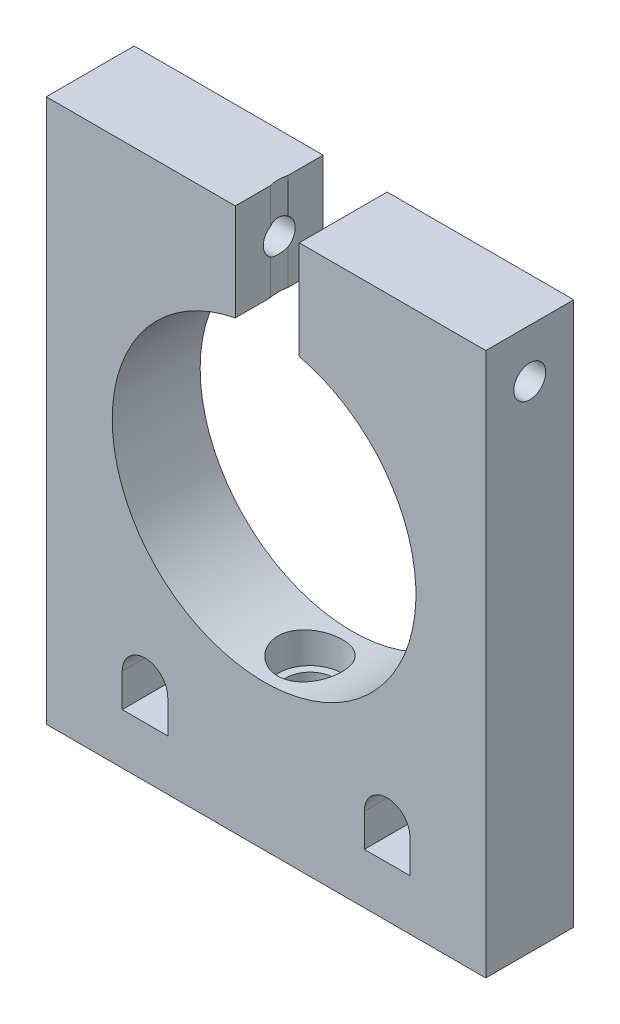
ISO-10303-21;
HEADER;
FILE_DESCRIPTION(('STEP AP214'),'2;1');
FILE_NAME('part.step','',(''),(''),'','','');
FILE_SCHEMA(('AUTOMOTIVE_DESIGN { 1 0 10303 214 1 1 1 1 }'));
ENDSEC;
DATA;
#1=APPLICATION_CONTEXT('core data for automotive mechanical design processes');
#2=APPLICATION_PROTOCOL_DEFINITION('international standard','automotive_design',2000,#1);
#3=PRODUCT_CONTEXT('',#1,'mechanical');
#4=PRODUCT('Part','Part','',(#3));
#5=PRODUCT_RELATED_PRODUCT_CATEGORY('part','',(#4));
#6=PRODUCT_DEFINITION_FORMATION('','',#4);
#7=PRODUCT_DEFINITION_CONTEXT('part definition',#1,'design');
#8=PRODUCT_DEFINITION('design','',#6,#7);
#9=PRODUCT_DEFINITION_SHAPE('','',#8);
#10=(LENGTH_UNIT() NAMED_UNIT(*) SI_UNIT(.MILLI.,.METRE.));
#11=(NAMED_UNIT(*) PLANE_ANGLE_UNIT() SI_UNIT($,.RADIAN.));
#12=(NAMED_UNIT(*) SI_UNIT($,.STERADIAN.) SOLID_ANGLE_UNIT());
#13=UNCERTAINTY_MEASURE_WITH_UNIT(LENGTH_MEASURE(1.E-05),#10,'distance_accuracy_value','');
#14=(GEOMETRIC_REPRESENTATION_CONTEXT(3) GLOBAL_UNCERTAINTY_ASSIGNED_CONTEXT((#13)) GLOBAL_UNIT_ASSIGNED_CONTEXT((#10,
#11,#12)) REPRESENTATION_CONTEXT('',''));
#15=CARTESIAN_POINT('',(0.,0.,0.));
#16=DIRECTION('',(0.,0.,1.));
#17=DIRECTION('',(1.,0.,0.));
#18=AXIS2_PLACEMENT_3D('',#15,#16,#17);
#19=CARTESIAN_POINT('',(-27.7462012428168,61.1736842105263,-6.00000000000001));
#20=DIRECTION('',(0.,0.,1.));
#21=DIRECTION('',(1.,0.,0.));
#22=AXIS2_PLACEMENT_3D('',#19,#20,#21);
#23=CYLINDRICAL_SURFACE('',#22,19.);
#24=CARTESIAN_POINT('',(-27.5,42.1752794104376,1.5));
#25=CARTESIAN_POINT('',(-27.7217018666897,42.1724103715578,1.50000770008445));
#26=CARTESIAN_POINT('',(-27.9435489338754,42.1734522579613,1.51849377762637));
#27=CARTESIAN_POINT('',(-28.3810596743175,42.1830299780645,1.59193005395871));
#28=CARTESIAN_POINT('',(-28.5967187785293,42.1915712091654,1.64690650851482));
#29=CARTESIAN_POINT('',(-29.0154614967003,42.214967725388,1.79157814962321));
#30=CARTESIAN_POINT('',(-29.2185565823367,42.2298171502916,1.8812411060413));
#31=CARTESIAN_POINT('',(-29.6068470708586,42.2640031779429,2.09264425718337));
#32=CARTESIAN_POINT('',(-29.7920431711632,42.2833396057585,2.21438320140393));
#33=CARTESIAN_POINT('',(-30.141833879553,42.324483118063,2.48824714392955));
#34=CARTESIAN_POINT('',(-30.3061469341108,42.3463176770726,2.64072762181321));
#35=CARTESIAN_POINT('',(-30.6070841731015,42.3896878719763,2.97097971039865));
#36=CARTESIAN_POINT('',(-30.7437060135643,42.4112234824217,3.14875345992677));
#37=CARTESIAN_POINT('',(-30.9868347341818,42.4516730332829,3.52691687410489));
#38=CARTESIAN_POINT('',(-31.09299431525,42.4705555759409,3.72753352261765));
#39=CARTESIAN_POINT('',(-31.2700085668532,42.5030941345313,4.14417803793059));
#40=CARTESIAN_POINT('',(-31.3408664806165,42.5167506305635,4.36020448691905));
#41=CARTESIAN_POINT('',(-31.4444275066021,42.5370026095041,4.7988161853216));
#42=CARTESIAN_POINT('',(-31.4775756904269,42.5436803810367,5.02129245204782));
#43=CARTESIAN_POINT('',(-31.5061536533168,42.5494262448601,5.46874110995883));
#44=CARTESIAN_POINT('',(-31.5015872772187,42.5484951128458,5.69371324436551));
#45=CARTESIAN_POINT('',(-31.4552516179099,42.539214291872,6.13618187179868));
#46=CARTESIAN_POINT('',(-31.4140443723721,42.5309766823904,6.35373993701321));
#47=CARTESIAN_POINT('',(-31.2964871676965,42.5082342789288,6.77879455751179));
#48=CARTESIAN_POINT('',(-31.2201354734391,42.4937291755179,6.98629061546449));
#49=CARTESIAN_POINT('',(-31.0339294373112,42.4600579644794,7.38691919996178));
#50=CARTESIAN_POINT('',(-30.9238567040569,42.440861643569,7.57994757290868));
#51=CARTESIAN_POINT('',(-30.6734728013341,42.4001091085841,7.94501026113929));
#52=CARTESIAN_POINT('',(-30.5331581714218,42.3785526245859,8.11704217036097));
#53=CARTESIAN_POINT('',(-30.2233363838518,42.3351959851917,8.4383862762789));
#54=CARTESIAN_POINT('',(-30.0533608008815,42.3133981783266,8.58724756877836));
#55=CARTESIAN_POINT('',(-29.6905820930684,42.2725560190596,8.85441415929888));
#56=CARTESIAN_POINT('',(-29.4977789330365,42.2535116709024,8.9727194102164));
#57=CARTESIAN_POINT('',(-29.0946319497242,42.2205158896697,9.17532815879864));
#58=CARTESIAN_POINT('',(-28.8842874955252,42.2065646398779,9.2596304328205));
#59=CARTESIAN_POINT('',(-28.4520819448592,42.1855698088592,9.39160331358108));
#60=CARTESIAN_POINT('',(-28.2302223748571,42.1785253145101,9.439278762466));
#61=CARTESIAN_POINT('',(-27.7855699893244,42.1724474977032,9.49597058400664));
#62=CARTESIAN_POINT('',(-27.5628655433673,42.1732725275786,9.50566608257451));
#63=CARTESIAN_POINT('',(-27.1191091576289,42.1827388920937,9.48801016240768));
#64=CARTESIAN_POINT('',(-26.8980571369785,42.1913798416672,9.46066056873698));
#65=CARTESIAN_POINT('',(-26.4656252527902,42.2156597319631,9.37020576322975));
#66=CARTESIAN_POINT('',(-26.2541833929784,42.2312435600566,9.30738112226466));
#67=CARTESIAN_POINT('',(-25.8448770216619,42.2679382518016,9.14812352359072));
#68=CARTESIAN_POINT('',(-25.6470137694562,42.2890496272135,9.05168745373929));
#69=CARTESIAN_POINT('',(-25.2671304321559,42.3351222052682,8.826233294048));
#70=CARTESIAN_POINT('',(-25.0854011965301,42.3601376796443,8.69673639361866));
#71=CARTESIAN_POINT('',(-24.7460187765882,42.4112639937943,8.40947196415671));
#72=CARTESIAN_POINT('',(-24.5883685947711,42.4373749696534,8.25170091484635));
#73=CARTESIAN_POINT('',(-24.2988656475771,42.4884520564316,7.90912352046247));
#74=CARTESIAN_POINT('',(-24.1674987525957,42.5133910441364,7.72390195248407));
#75=CARTESIAN_POINT('',(-23.937767776736,42.5589157083065,7.33351722348626));
#76=CARTESIAN_POINT('',(-23.839401852302,42.5795016279266,7.12835517724149));
#77=CARTESIAN_POINT('',(-23.6793216444684,42.6138570085229,6.70545939718692));
#78=CARTESIAN_POINT('',(-23.6173309005816,42.6276777495585,6.4878346629939));
#79=CARTESIAN_POINT('',(-23.5308735425515,42.6471353371888,6.04491011001001));
#80=CARTESIAN_POINT('',(-23.5064007392161,42.6527735336185,5.81961156340865));
#81=CARTESIAN_POINT('',(-23.4959215704313,42.6551761673556,5.37320256340272));
#82=CARTESIAN_POINT('',(-23.509056087679,42.6521387968138,5.15211289859532));
#83=CARTESIAN_POINT('',(-23.5715099361637,42.6379630294477,4.71538301869289));
#84=CARTESIAN_POINT('',(-23.6208288181704,42.6268247331968,4.49974273597795));
#85=CARTESIAN_POINT('',(-23.7538532039274,42.5977391761712,4.08064444546885));
#86=CARTESIAN_POINT('',(-23.8374448255584,42.5798144803386,3.8771486250396));
#87=CARTESIAN_POINT('',(-24.036530551839,42.5390760180119,3.48695078764513));
#88=CARTESIAN_POINT('',(-24.1520279782906,42.5162617425057,3.30025052199631));
#89=CARTESIAN_POINT('',(-24.4144784872118,42.4675954691897,2.94473299038067));
#90=CARTESIAN_POINT('',(-24.5620387174293,42.4416899347938,2.77637120044933));
#91=CARTESIAN_POINT('',(-24.883168787113,42.3899293555899,2.46652185808063));
#92=CARTESIAN_POINT('',(-25.0567450098294,42.3640743247549,2.32504092046722));
#93=CARTESIAN_POINT('',(-25.4279746293888,42.3146981756074,2.0710016463401));
#94=CARTESIAN_POINT('',(-25.6259395192041,42.2912161519886,1.95889047293757));
#95=CARTESIAN_POINT('',(-26.0383505886409,42.2494656129186,1.76972453952534));
#96=CARTESIAN_POINT('',(-26.252782522922,42.2311926542788,1.69263986933367));
#97=CARTESIAN_POINT('',(-26.6395670090449,42.2051956948389,1.58980171357834));
#98=CARTESIAN_POINT('',(-26.809775863227,42.1959957168126,1.55619479211134));
#99=CARTESIAN_POINT('',(-27.1532936285642,42.1821596416176,1.51129141203475));
#100=CARTESIAN_POINT('',(-27.3266024037937,42.1775233448374,1.49999397760536));
#101=CARTESIAN_POINT('',(-27.5,42.1752794104376,1.5));
#102=B_SPLINE_CURVE_WITH_KNOTS('',3,(#24,#25,#26,#27,#28,#29,#30,#31,#32,#33,#34,#35,#36,#37,
#38,#39,#40,#41,#42,#43,#44,#45,#46,#47,#48,#49,#50,#51,#52,#53,#54,#55,#56,#57,#58,#59,#60,#61,
#62,#63,#64,#65,#66,#67,#68,#69,#70,#71,#72,#73,#74,#75,#76,#77,#78,#79,#80,#81,#82,#83,#84,#85,
#86,#87,#88,#89,#90,#91,#92,#93,#94,#95,#96,#97,#98,#99,#100,#101),.UNSPECIFIED.,.T.,.F.,(4,2,2,
2,2,2,2,2,2,2,2,2,2,2,2,2,2,2,2,2,2,2,2,2,2,2,2,2,2,2,2,2,2,2,2,2,2,2,4),(0.,0.664528654488198,
1.3295359735315,1.99392685701593,2.65829184261749,3.33083213152481,4.00342932500227,
4.68341499985382,5.36333819166216,6.03515046541458,6.70689425164483,7.36850851197358,
8.03015544042002,8.69618145180882,9.3622837140513,10.0400572364839,10.7178318037294,
11.3956307594287,12.0733400932004,12.7388743340253,13.4043757878242,14.0646860893265,
14.7250575463952,15.3955969010377,16.066219799372,16.7482810160543,17.4303041239376,
18.1070741987338,18.7837326173244,19.4450573401633,20.1063738527692,20.7655105131123,
21.4247158238861,22.0977028573266,22.7708552851252,23.4537284428992,24.1360173738501,
24.6557816565066,25.1755232041037),.UNSPECIFIED.);
#103=CARTESIAN_POINT('',(-27.5,42.1752794104376,1.5));
#104=VERTEX_POINT('',#103);
#105=EDGE_CURVE('E257',#104,#104,#102,.T.);
#106=ORIENTED_EDGE('',*,*,#105,.F.);
#107=EDGE_LOOP('',(#106));
#108=FACE_BOUND('',#107,.T.);
#109=CARTESIAN_POINT('',(-31.3503534506357,79.828712671048,6.58387190441372));
#110=CARTESIAN_POINT('',(-31.3806292223616,79.8228563577791,6.47636807262866));
#111=CARTESIAN_POINT('',(-31.4063895866646,79.8178097405828,6.36754745538005));
#112=CARTESIAN_POINT('',(-31.4487349312383,79.809450369709,6.14804444104768));
#113=CARTESIAN_POINT('',(-31.4653178308129,79.8061380092278,6.03736162762665));
#114=CARTESIAN_POINT('',(-31.4888758890616,79.8014192512206,5.8175118380989));
#115=CARTESIAN_POINT('',(-31.4960631505597,79.7999707891789,5.70836850737569));
#116=CARTESIAN_POINT('',(-31.5014797146783,79.7988790506932,5.48989423768962));
#117=CARTESIAN_POINT('',(-31.4997119835581,79.7992351764959,5.38056337283989));
#118=CARTESIAN_POINT('',(-31.485249891384,79.8021476422983,5.1279491714312));
#119=CARTESIAN_POINT('',(-31.4692804037088,79.8053634531291,4.98485000692258));
#120=CARTESIAN_POINT('',(-31.4217267091787,79.8147918662821,4.69908975122264));
#121=CARTESIAN_POINT('',(-31.3899047216102,79.8210500675667,4.55646969743279));
#122=CARTESIAN_POINT('',(-31.3503534506357,79.828712671048,4.41612809558628));
#123=B_SPLINE_CURVE_WITH_KNOTS('',3,(#109,#110,#111,#112,#113,#114,#115,#116,#117,#118,#119,
#120,#121,#122),.UNSPECIFIED.,.F.,.F.,(4,2,2,2,2,2,4),(0.,0.335418724365017,0.67091346305818,
0.998695724341374,1.32636941785424,1.7575489207512,2.1953999921887),.UNSPECIFIED.);
#124=CARTESIAN_POINT('',(-31.3503534506357,79.828712671048,6.58387190441372));
#125=VERTEX_POINT('',#124);
#126=CARTESIAN_POINT('',(-31.3503534506357,79.828712671048,4.41612809558628));
#127=VERTEX_POINT('',#126);
#128=EDGE_CURVE('E250',#125,#127,#123,.T.);
#129=ORIENTED_EDGE('',*,*,#128,.F.);
#130=DIRECTION('',(0.,0.,1.));
#131=VECTOR('',#130,1.);
#132=CARTESIAN_POINT('',(-31.3503534506357,79.828712671048,-6.00000000000001));
#133=LINE('',#132,#131);
#134=CARTESIAN_POINT('',(-31.3503534506357,79.828712671048,11.));
#135=VERTEX_POINT('',#134);
#136=EDGE_CURVE('E308',#125,#135,#133,.T.);
#137=ORIENTED_EDGE('',*,*,#136,.T.);
#138=CARTESIAN_POINT('',(-27.7462012428168,61.1736842105263,11.));
#139=DIRECTION('',(0.,0.,-1.));
#140=DIRECTION('',(-1.,0.,0.));
#141=AXIS2_PLACEMENT_3D('',#138,#139,#140);
#142=CIRCLE('',#141,19.);
#143=CARTESIAN_POINT('',(-23.3503534506357,79.6581783120152,11.));
#144=VERTEX_POINT('',#143);
#145=EDGE_CURVE('E394',#135,#144,#142,.F.);
#146=ORIENTED_EDGE('',*,*,#145,.T.);
#147=DIRECTION('',(0.,0.,1.));
#148=VECTOR('',#147,1.);
#149=CARTESIAN_POINT('',(-23.3503534506357,79.6581783120152,-6.00000000000001));
#150=LINE('',#149,#148);
#151=CARTESIAN_POINT('',(-23.3503534506357,79.6581783120152,0.));
#152=VERTEX_POINT('',#151);
#153=EDGE_CURVE('E304',#152,#144,#150,.T.);
#154=ORIENTED_EDGE('',*,*,#153,.F.);
#155=CARTESIAN_POINT('',(-27.7462012428168,61.1736842105263,0.));
#156=DIRECTION('',(0.,0.,1.));
#157=DIRECTION('',(1.,0.,0.));
#158=AXIS2_PLACEMENT_3D('',#155,#156,#157);
#159=CIRCLE('',#158,19.);
#160=CARTESIAN_POINT('',(-31.3503534506357,79.828712671048,0.));
#161=VERTEX_POINT('',#160);
#162=EDGE_CURVE('E313',#161,#152,#159,.T.);
#163=ORIENTED_EDGE('',*,*,#162,.F.);
#164=EDGE_CURVE('E200',#161,#127,#133,.T.);
#165=ORIENTED_EDGE('',*,*,#164,.T.);
#166=EDGE_LOOP('',(#129,#137,#146,#154,#163,#165));
#167=FACE_BOUND('',#166,.T.);
#168=ADVANCED_FACE('F33',(#108,#167),#23,.F.);
#169=CARTESIAN_POINT('',(-31.3503534506357,93.8364690107768,-35.));
#170=DIRECTION('',(-1.,0.,0.));
#171=DIRECTION('',(0.,0.,1.));
#172=AXIS2_PLACEMENT_3D('',#169,#170,#171);
#173=PLANE('',#172);
#174=DIRECTION('',(0.,-1.,0.));
#175=VECTOR('',#174,1.);
#176=CARTESIAN_POINT('',(-31.3503534506357,127.5,4.41612809558628));
#177=LINE('',#176,#175);
#178=CARTESIAN_POINT('',(-31.3503534506357,84.2078129318689,4.41612809558628));
#179=VERTEX_POINT('',#178);
#180=EDGE_CURVE('E53',#127,#179,#177,.F.);
#181=ORIENTED_EDGE('',*,*,#180,.F.);
#182=ORIENTED_EDGE('',*,*,#164,.F.);
#183=DIRECTION('',(0.,-1.,0.));
#184=VECTOR('',#183,1.);
#185=CARTESIAN_POINT('',(-31.3503534506357,0.,0.));
#186=LINE('',#185,#184);
#187=CARTESIAN_POINT('',(-31.3503534506357,91.9736842105263,0.));
#188=VERTEX_POINT('',#187);
#189=EDGE_CURVE('E327',#188,#161,#186,.T.);
#190=ORIENTED_EDGE('',*,*,#189,.F.);
#191=DIRECTION('',(0.,0.,-1.));
#192=VECTOR('',#191,1.);
#193=CARTESIAN_POINT('',(-31.3503534506357,91.9736842105263,0.));
#194=LINE('',#193,#192);
#195=CARTESIAN_POINT('',(-31.3503534506357,91.9736842105263,4.41612809558628));
#196=VERTEX_POINT('',#195);
#197=EDGE_CURVE('E187',#196,#188,#194,.T.);
#198=ORIENTED_EDGE('',*,*,#197,.F.);
#199=CARTESIAN_POINT('',(-31.3503534506357,87.5694920925399,4.41612809558622));
#200=VERTEX_POINT('',#199);
#201=EDGE_CURVE('E174',#200,#196,#177,.F.);
#202=ORIENTED_EDGE('',*,*,#201,.F.);
#203=CARTESIAN_POINT('',(-31.3503534506357,85.8886525122044,5.5));
#204=DIRECTION('',(-1.,0.,0.));
#205=DIRECTION('',(0.,0.,1.));
#206=AXIS2_PLACEMENT_3D('',#203,#204,#205);
#207=CIRCLE('',#206,2.);
#208=EDGE_CURVE('E185',#200,#179,#207,.T.);
#209=ORIENTED_EDGE('',*,*,#208,.T.);
#210=EDGE_LOOP('',(#181,#182,#190,#198,#202,#209));
#211=FACE_BOUND('',#210,.T.);
#212=ADVANCED_FACE('F184',(#211),#173,.F.);
#213=DIRECTION('',(0.,-1.,0.));
#214=VECTOR('',#213,1.);
#215=CARTESIAN_POINT('',(-31.3503534506357,127.5,6.58387190441372));
#216=LINE('',#215,#214);
#217=CARTESIAN_POINT('',(-31.3503534506357,91.9736842105263,6.58387190441372));
#218=VERTEX_POINT('',#217);
#219=CARTESIAN_POINT('',(-31.3503534506357,87.56949209254,6.58387190441372));
#220=VERTEX_POINT('',#219);
#221=EDGE_CURVE('E61',#218,#220,#216,.T.);
#222=ORIENTED_EDGE('',*,*,#221,.F.);
#223=CARTESIAN_POINT('',(-31.3503534506357,91.9736842105263,11.));
#224=VERTEX_POINT('',#223);
#225=EDGE_CURVE('E316',#224,#218,#194,.T.);
#226=ORIENTED_EDGE('',*,*,#225,.F.);
#227=DIRECTION('',(0.,-1.,0.));
#228=VECTOR('',#227,1.);
#229=CARTESIAN_POINT('',(-31.3503534506357,93.8364690107768,11.));
#230=LINE('',#229,#228);
#231=EDGE_CURVE('E398',#224,#135,#230,.T.);
#232=ORIENTED_EDGE('',*,*,#231,.T.);
#233=ORIENTED_EDGE('',*,*,#136,.F.);
#234=CARTESIAN_POINT('',(-31.3503534506357,84.2078129318689,6.58387190441377));
#235=VERTEX_POINT('',#234);
#236=EDGE_CURVE('E636',#235,#125,#216,.T.);
#237=ORIENTED_EDGE('',*,*,#236,.F.);
#238=EDGE_CURVE('E192',#235,#220,#207,.T.);
#239=ORIENTED_EDGE('',*,*,#238,.T.);
#240=EDGE_LOOP('',(#222,#226,#232,#233,#237,#239));
#241=FACE_BOUND('',#240,.T.);
#242=ADVANCED_FACE('F402',(#241),#173,.F.);
#243=CARTESIAN_POINT('',(0.,85.8886525122044,5.5));
#244=DIRECTION('',(-1.,0.,0.));
#245=DIRECTION('',(0.,-1.,0.));
#246=AXIS2_PLACEMENT_3D('',#243,#244,#245);
#247=CYLINDRICAL_SURFACE('',#246,2.);
#248=CARTESIAN_POINT('',(-55.,85.8886525122044,5.5));
#249=DIRECTION('',(-1.,0.,0.));
#250=DIRECTION('',(0.,-1.,0.));
#251=AXIS2_PLACEMENT_3D('',#248,#249,#250);
#252=CIRCLE('',#251,2.);
#253=CARTESIAN_POINT('',(-55.,83.8886525122044,5.5));
#254=VERTEX_POINT('',#253);
#255=EDGE_CURVE('E291',#254,#254,#252,.T.);
#256=ORIENTED_EDGE('',*,*,#255,.T.);
#257=EDGE_LOOP('',(#256));
#258=FACE_BOUND('',#257,.T.);
#259=CARTESIAN_POINT('',(-31.3503534506357,84.2078129318689,4.41612809558622));
#260=CARTESIAN_POINT('',(-31.362630383764,84.1796954560201,4.45973668327664));
#261=CARTESIAN_POINT('',(-31.374434084655,84.1532209737575,4.50451670047516));
#262=CARTESIAN_POINT('',(-31.3968549659324,84.1037241953998,4.59625543129952));
#263=CARTESIAN_POINT('',(-31.4074716084784,84.0807034625511,4.64321511897859));
#264=CARTESIAN_POINT('',(-31.4371906874607,84.0170510572618,4.78718385548501));
#265=CARTESIAN_POINT('',(-31.4541283263269,83.9819048891575,4.8871656702633));
#266=CARTESIAN_POINT('',(-31.4805578747774,83.92768179838,5.09266032348111));
#267=CARTESIAN_POINT('',(-31.4900272463252,83.9086535041815,5.19818888677966));
#268=CARTESIAN_POINT('',(-31.500430519901,83.8877702989694,5.4111900793106));
#269=CARTESIAN_POINT('',(-31.501380072128,83.88588389964,5.51865878049561));
#270=CARTESIAN_POINT('',(-31.4948565785343,83.8989530584964,5.72675317724902));
#271=CARTESIAN_POINT('',(-31.4878106361095,83.9130545420167,5.82744832978048));
#272=CARTESIAN_POINT('',(-31.4666489466634,83.9561272439024,6.02494404089119));
#273=CARTESIAN_POINT('',(-31.4525259940726,83.9851136183007,6.1217405212338));
#274=CARTESIAN_POINT('',(-31.423709769461,84.0458351897245,6.28030812980855));
#275=CARTESIAN_POINT('',(-31.410507635654,84.0740279692839,6.3437485901473));
#276=CARTESIAN_POINT('',(-31.3819267527111,84.1364810367601,6.46676686494665));
#277=CARTESIAN_POINT('',(-31.3665557484324,84.1707198397368,6.52635736873644));
#278=CARTESIAN_POINT('',(-31.3503534506357,84.2078129318689,6.58387190441377));
#279=B_SPLINE_CURVE_WITH_KNOTS('',3,(#259,#260,#261,#262,#263,#264,#265,#266,#267,#268,#269,
#270,#271,#272,#273,#274,#275,#276,#277,#278),.UNSPECIFIED.,.F.,.F.,(4,2,2,2,2,2,2,2,2,4),(0.,
0.159880300843976,0.319832750280948,0.640162691290843,0.96145567673348,1.28215835260008,
1.58650439538433,1.89116094443954,2.10278443628042,2.31367051262519),.UNSPECIFIED.);
#280=EDGE_CURVE('E11',#179,#235,#279,.T.);
#281=ORIENTED_EDGE('',*,*,#280,.F.);
#282=ORIENTED_EDGE('',*,*,#208,.F.);
#283=CARTESIAN_POINT('',(-31.3503534506357,87.5694920925399,6.58387190441377));
#284=CARTESIAN_POINT('',(-31.362630383764,87.5976095683888,6.54026331672336));
#285=CARTESIAN_POINT('',(-31.374434084655,87.6240840506513,6.49548329952484));
#286=CARTESIAN_POINT('',(-31.3968549659324,87.6735808290091,6.40374456870047));
#287=CARTESIAN_POINT('',(-31.4074716084784,87.6966015618577,6.3567848810214));
#288=CARTESIAN_POINT('',(-31.4371906874607,87.7602539671471,6.21281614451498));
#289=CARTESIAN_POINT('',(-31.4541283263269,87.7954001352513,6.1128343297367));
#290=CARTESIAN_POINT('',(-31.4805578747774,87.8496232260288,5.90733967651889));
#291=CARTESIAN_POINT('',(-31.4900272463252,87.8686515202273,5.80181111322033));
#292=CARTESIAN_POINT('',(-31.500430519901,87.8895347254394,5.5888099206894));
#293=CARTESIAN_POINT('',(-31.501380072128,87.8914211247688,5.48134121950439));
#294=CARTESIAN_POINT('',(-31.4948565785343,87.8783519659125,5.27324682275098));
#295=CARTESIAN_POINT('',(-31.4878106361095,87.8642504823921,5.17255167021952));
#296=CARTESIAN_POINT('',(-31.4666489466634,87.8211777805065,4.97505595910881));
#297=CARTESIAN_POINT('',(-31.4525259940726,87.7921914061081,4.8782594787662));
#298=CARTESIAN_POINT('',(-31.423709769461,87.7314698346844,4.71969187019144));
#299=CARTESIAN_POINT('',(-31.410507635654,87.703277055125,4.65625140985269));
#300=CARTESIAN_POINT('',(-31.3819267527111,87.6408239876488,4.53323313505334));
#301=CARTESIAN_POINT('',(-31.3665557484324,87.6065851846721,4.47364263126356));
#302=CARTESIAN_POINT('',(-31.3503534506357,87.5694920925399,4.41612809558622));
#303=B_SPLINE_CURVE_WITH_KNOTS('',3,(#283,#284,#285,#286,#287,#288,#289,#290,#291,#292,#293,
#294,#295,#296,#297,#298,#299,#300,#301,#302),.UNSPECIFIED.,.F.,.F.,(4,2,2,2,2,2,2,2,2,4),(0.,
0.159880300843983,0.319832750280953,0.640162691290842,0.961455676733478,1.28215835260008,
1.58650439538433,1.89116094443954,2.10278443628042,2.31367051262519),.UNSPECIFIED.);
#304=EDGE_CURVE('E47',#220,#200,#303,.T.);
#305=ORIENTED_EDGE('',*,*,#304,.F.);
#306=ORIENTED_EDGE('',*,*,#238,.F.);
#307=EDGE_LOOP('',(#281,#282,#305,#306));
#308=FACE_BOUND('',#307,.T.);
#309=ADVANCED_FACE('F190',(#258,#308),#247,.F.);
#310=CARTESIAN_POINT('',(-27.5,112.973684210526,5.5));
#311=DIRECTION('',(0.,-1.,0.));
#312=DIRECTION('',(0.,0.,-1.));
#313=AXIS2_PLACEMENT_3D('',#310,#311,#312);
#314=CYLINDRICAL_SURFACE('',#313,3.);
#315=CARTESIAN_POINT('',(-27.5,23.9736842105263,5.5));
#316=DIRECTION('',(0.,-1.,0.));
#317=DIRECTION('',(0.,0.,-1.));
#318=AXIS2_PLACEMENT_3D('',#315,#316,#317);
#319=CIRCLE('',#318,3.);
#320=CARTESIAN_POINT('',(-27.5,23.9736842105263,2.5));
#321=VERTEX_POINT('',#320);
#322=EDGE_CURVE('E413',#321,#321,#319,.T.);
#323=ORIENTED_EDGE('',*,*,#322,.T.);
#324=EDGE_LOOP('',(#323));
#325=FACE_BOUND('',#324,.T.);
#326=CARTESIAN_POINT('',(-27.5,38.5,5.5));
#327=DIRECTION('',(0.,1.,0.));
#328=DIRECTION('',(0.,0.,1.));
#329=AXIS2_PLACEMENT_3D('',#326,#327,#328);
#330=CIRCLE('',#329,3.);
#331=CARTESIAN_POINT('',(-27.5,38.5,8.5));
#332=VERTEX_POINT('',#331);
#333=EDGE_CURVE('E224',#332,#332,#330,.F.);
#334=ORIENTED_EDGE('',*,*,#333,.F.);
#335=EDGE_LOOP('',(#334));
#336=FACE_BOUND('',#335,.T.);
#337=ADVANCED_FACE('F243',(#325,#336),#314,.F.);
#338=CARTESIAN_POINT('',(0.,0.,0.));
#339=DIRECTION('',(0.,0.,1.));
#340=DIRECTION('',(1.,0.,0.));
#341=AXIS2_PLACEMENT_3D('',#338,#339,#340);
#342=PLANE('',#341);
#343=DIRECTION('',(1.,0.,0.));
#344=VECTOR('',#343,1.);
#345=CARTESIAN_POINT('',(-55.,91.9736842105263,0.));
#346=LINE('',#345,#344);
#347=CARTESIAN_POINT('',(-55.,91.9736842105263,0.));
#348=VERTEX_POINT('',#347);
#349=EDGE_CURVE('E331',#348,#188,#346,.T.);
#350=ORIENTED_EDGE('',*,*,#349,.T.);
#351=ORIENTED_EDGE('',*,*,#189,.T.);
#352=ORIENTED_EDGE('',*,*,#162,.T.);
#353=DIRECTION('',(0.,-1.,0.));
#354=VECTOR('',#353,1.);
#355=CARTESIAN_POINT('',(-23.3503534506357,0.,0.));
#356=LINE('',#355,#354);
#357=CARTESIAN_POINT('',(-23.3503534506357,91.9736842105263,0.));
#358=VERTEX_POINT('',#357);
#359=EDGE_CURVE('E195',#358,#152,#356,.T.);
#360=ORIENTED_EDGE('',*,*,#359,.F.);
#361=CARTESIAN_POINT('',(0.,91.9736842105263,0.));
#362=VERTEX_POINT('',#361);
#363=EDGE_CURVE('E321',#358,#362,#346,.T.);
#364=ORIENTED_EDGE('',*,*,#363,.T.);
#365=DIRECTION('',(0.,1.,0.));
#366=VECTOR('',#365,1.);
#367=CARTESIAN_POINT('',(0.,41.9736842105263,0.));
#368=LINE('',#367,#366);
#369=CARTESIAN_POINT('',(0.,23.9736842105263,0.));
#370=VERTEX_POINT('',#369);
#371=EDGE_CURVE('E336',#370,#362,#368,.T.);
#372=ORIENTED_EDGE('',*,*,#371,.F.);
#373=DIRECTION('',(1.,0.,0.));
#374=VECTOR('',#373,1.);
#375=CARTESIAN_POINT('',(-55.,23.9736842105263,0.));
#376=LINE('',#375,#374);
#377=CARTESIAN_POINT('',(-55.,23.9736842105263,0.));
#378=VERTEX_POINT('',#377);
#379=EDGE_CURVE('E309',#378,#370,#376,.T.);
#380=ORIENTED_EDGE('',*,*,#379,.F.);
#381=DIRECTION('',(0.,-1.,0.));
#382=VECTOR('',#381,1.);
#383=CARTESIAN_POINT('',(-55.,41.9736842105263,0.));
#384=LINE('',#383,#382);
#385=EDGE_CURVE('E299',#348,#378,#384,.T.);
#386=ORIENTED_EDGE('',*,*,#385,.F.);
#387=EDGE_LOOP('',(#350,#351,#352,#360,#364,#372,#380,#386));
#388=FACE_BOUND('',#387,.T.);
#389=DIRECTION('',(0.,-1.,0.));
#390=VECTOR('',#389,1.);
#391=CARTESIAN_POINT('',(-15.2,0.,0.));
#392=LINE('',#391,#390);
#393=CARTESIAN_POINT('',(-15.2,34.4736842105263,0.));
#394=VERTEX_POINT('',#393);
#395=CARTESIAN_POINT('',(-15.2,30.3118258032643,0.));
#396=VERTEX_POINT('',#395);
#397=EDGE_CURVE('E208',#394,#396,#392,.T.);
#398=ORIENTED_EDGE('',*,*,#397,.T.);
#399=DIRECTION('',(1.,0.,0.));
#400=VECTOR('',#399,1.);
#401=CARTESIAN_POINT('',(0.,30.3118258032643,0.));
#402=LINE('',#401,#400);
#403=CARTESIAN_POINT('',(-9.5,30.3118258032643,0.));
#404=VERTEX_POINT('',#403);
#405=EDGE_CURVE('E211',#396,#404,#402,.T.);
#406=ORIENTED_EDGE('',*,*,#405,.T.);
#407=DIRECTION('',(0.,1.,0.));
#408=VECTOR('',#407,1.);
#409=CARTESIAN_POINT('',(-9.49999999999999,0.,0.));
#410=LINE('',#409,#408);
#411=CARTESIAN_POINT('',(-9.5,34.4736842105263,0.));
#412=VERTEX_POINT('',#411);
#413=EDGE_CURVE('E202',#404,#412,#410,.T.);
#414=ORIENTED_EDGE('',*,*,#413,.T.);
#415=CARTESIAN_POINT('',(-12.35,34.4736842105263,0.));
#416=DIRECTION('',(0.,0.,1.));
#417=DIRECTION('',(1.,0.,0.));
#418=AXIS2_PLACEMENT_3D('',#415,#416,#417);
#419=CIRCLE('',#418,2.85);
#420=EDGE_CURVE('E205',#412,#394,#419,.T.);
#421=ORIENTED_EDGE('',*,*,#420,.T.);
#422=EDGE_LOOP('',(#398,#406,#414,#421));
#423=FACE_BOUND('',#422,.T.);
#424=CARTESIAN_POINT('',(-42.65,34.4736842105263,0.));
#425=DIRECTION('',(0.,0.,1.));
#426=DIRECTION('',(1.,0.,0.));
#427=AXIS2_PLACEMENT_3D('',#424,#425,#426);
#428=CIRCLE('',#427,2.85);
#429=CARTESIAN_POINT('',(-45.5,34.4736842105263,0.));
#430=VERTEX_POINT('',#429);
#431=CARTESIAN_POINT('',(-39.8,34.4736842105263,0.));
#432=VERTEX_POINT('',#431);
#433=EDGE_CURVE('E221',#430,#432,#428,.F.);
#434=ORIENTED_EDGE('',*,*,#433,.F.);
#435=DIRECTION('',(0.,1.,0.));
#436=VECTOR('',#435,1.);
#437=CARTESIAN_POINT('',(-45.5,0.,0.));
#438=LINE('',#437,#436);
#439=CARTESIAN_POINT('',(-45.5,30.3118258032643,0.));
#440=VERTEX_POINT('',#439);
#441=EDGE_CURVE('E214',#440,#430,#438,.T.);
#442=ORIENTED_EDGE('',*,*,#441,.F.);
#443=DIRECTION('',(1.,0.,0.));
#444=VECTOR('',#443,1.);
#445=CARTESIAN_POINT('',(0.,30.3118258032643,0.));
#446=LINE('',#445,#444);
#447=CARTESIAN_POINT('',(-39.8,30.3118258032643,0.));
#448=VERTEX_POINT('',#447);
#449=EDGE_CURVE('E216',#440,#448,#446,.T.);
#450=ORIENTED_EDGE('',*,*,#449,.T.);
#451=DIRECTION('',(0.,-1.,0.));
#452=VECTOR('',#451,1.);
#453=CARTESIAN_POINT('',(-39.8,0.,0.));
#454=LINE('',#453,#452);
#455=EDGE_CURVE('E219',#432,#448,#454,.T.);
#456=ORIENTED_EDGE('',*,*,#455,.F.);
#457=EDGE_LOOP('',(#434,#442,#450,#456));
#458=FACE_BOUND('',#457,.T.);
#459=ADVANCED_FACE('F275',(#388,#423,#458),#342,.F.);
#460=CARTESIAN_POINT('',(0.,91.9736842105263,0.));
#461=DIRECTION('',(0.,-1.,0.));
#462=DIRECTION('',(0.,0.,-1.));
#463=AXIS2_PLACEMENT_3D('',#460,#461,#462);
#464=PLANE('',#463);
#465=DIRECTION('',(0.,0.,-1.));
#466=VECTOR('',#465,1.);
#467=CARTESIAN_POINT('',(-23.3503534506357,91.9736842105263,0.));
#468=LINE('',#467,#466);
#469=CARTESIAN_POINT('',(-23.3503534506357,91.9736842105263,11.));
#470=VERTEX_POINT('',#469);
#471=EDGE_CURVE('E350',#470,#358,#468,.T.);
#472=ORIENTED_EDGE('',*,*,#471,.F.);
#473=DIRECTION('',(1.,0.,0.));
#474=VECTOR('',#473,1.);
#475=CARTESIAN_POINT('',(0.,91.9736842105263,11.));
#476=LINE('',#475,#474);
#477=CARTESIAN_POINT('',(0.,91.9736842105263,11.));
#478=VERTEX_POINT('',#477);
#479=EDGE_CURVE('E349',#470,#478,#476,.T.);
#480=ORIENTED_EDGE('',*,*,#479,.T.);
#481=DIRECTION('',(0.,0.,1.));
#482=VECTOR('',#481,1.);
#483=CARTESIAN_POINT('',(0.,91.9736842105263,0.));
#484=LINE('',#483,#482);
#485=EDGE_CURVE('E315',#362,#478,#484,.T.);
#486=ORIENTED_EDGE('',*,*,#485,.F.);
#487=ORIENTED_EDGE('',*,*,#363,.F.);
#488=EDGE_LOOP('',(#472,#480,#486,#487));
#489=FACE_BOUND('',#488,.T.);
#490=ADVANCED_FACE('F274',(#489),#464,.F.);
#491=CARTESIAN_POINT('',(0.,41.9736842105263,15.));
#492=DIRECTION('',(-1.,0.,0.));
#493=DIRECTION('',(0.,0.,1.));
#494=AXIS2_PLACEMENT_3D('',#491,#492,#493);
#495=PLANE('',#494);
#496=CARTESIAN_POINT('',(0.,85.8886525122044,5.5));
#497=DIRECTION('',(-1.,0.,0.));
#498=DIRECTION('',(0.,-1.,0.));
#499=AXIS2_PLACEMENT_3D('',#496,#497,#498);
#500=CIRCLE('',#499,2.);
#501=CARTESIAN_POINT('',(0.,83.8886525122044,5.5));
#502=VERTEX_POINT('',#501);
#503=EDGE_CURVE('E197',#502,#502,#500,.T.);
#504=ORIENTED_EDGE('',*,*,#503,.T.);
#505=EDGE_LOOP('',(#504));
#506=FACE_BOUND('',#505,.T.);
#507=ORIENTED_EDGE('',*,*,#485,.T.);
#508=DIRECTION('',(0.,-1.,0.));
#509=VECTOR('',#508,1.);
#510=CARTESIAN_POINT('',(0.,96.9736842105263,11.));
#511=LINE('',#510,#509);
#512=CARTESIAN_POINT('',(0.,23.9736842105263,11.));
#513=VERTEX_POINT('',#512);
#514=EDGE_CURVE('E411',#478,#513,#511,.T.);
#515=ORIENTED_EDGE('',*,*,#514,.T.);
#516=DIRECTION('',(0.,0.,-1.));
#517=VECTOR('',#516,1.);
#518=CARTESIAN_POINT('',(0.,23.9736842105263,15.));
#519=LINE('',#518,#517);
#520=EDGE_CURVE('E305',#513,#370,#519,.T.);
#521=ORIENTED_EDGE('',*,*,#520,.T.);
#522=ORIENTED_EDGE('',*,*,#371,.T.);
#523=EDGE_LOOP('',(#507,#515,#521,#522));
#524=FACE_BOUND('',#523,.T.);
#525=ADVANCED_FACE('F35',(#506,#524),#495,.F.);
#526=CARTESIAN_POINT('',(-55.,41.9736842105263,15.));
#527=DIRECTION('',(1.,0.,0.));
#528=DIRECTION('',(0.,1.,0.));
#529=AXIS2_PLACEMENT_3D('',#526,#527,#528);
#530=PLANE('',#529);
#531=ORIENTED_EDGE('',*,*,#255,.F.);
#532=EDGE_LOOP('',(#531));
#533=FACE_BOUND('',#532,.T.);
#534=DIRECTION('',(0.,0.,-1.));
#535=VECTOR('',#534,1.);
#536=CARTESIAN_POINT('',(-55.,23.9736842105263,15.));
#537=LINE('',#536,#535);
#538=CARTESIAN_POINT('',(-55.,23.9736842105263,11.));
#539=VERTEX_POINT('',#538);
#540=EDGE_CURVE('E295',#539,#378,#537,.T.);
#541=ORIENTED_EDGE('',*,*,#540,.F.);
#542=DIRECTION('',(0.,-1.,0.));
#543=VECTOR('',#542,1.);
#544=CARTESIAN_POINT('',(-55.,96.9736842105263,11.));
#545=LINE('',#544,#543);
#546=CARTESIAN_POINT('',(-55.,91.9736842105263,11.));
#547=VERTEX_POINT('',#546);
#548=EDGE_CURVE('E297',#547,#539,#545,.T.);
#549=ORIENTED_EDGE('',*,*,#548,.F.);
#550=DIRECTION('',(0.,0.,1.));
#551=VECTOR('',#550,1.);
#552=CARTESIAN_POINT('',(-55.,91.9736842105263,0.));
#553=LINE('',#552,#551);
#554=EDGE_CURVE('E334',#348,#547,#553,.T.);
#555=ORIENTED_EDGE('',*,*,#554,.F.);
#556=ORIENTED_EDGE('',*,*,#385,.T.);
#557=EDGE_LOOP('',(#541,#549,#555,#556));
#558=FACE_BOUND('',#557,.T.);
#559=ADVANCED_FACE('F280',(#533,#558),#530,.F.);
#560=CARTESIAN_POINT('',(-55.,23.9736842105263,15.));
#561=DIRECTION('',(0.,1.,0.));
#562=DIRECTION('',(0.,0.,1.));
#563=AXIS2_PLACEMENT_3D('',#560,#561,#562);
#564=PLANE('',#563);
#565=ORIENTED_EDGE('',*,*,#322,.F.);
#566=EDGE_LOOP('',(#565));
#567=FACE_BOUND('',#566,.T.);
#568=ORIENTED_EDGE('',*,*,#520,.F.);
#569=DIRECTION('',(1.,0.,0.));
#570=VECTOR('',#569,1.);
#571=CARTESIAN_POINT('',(-55.,23.9736842105263,11.));
#572=LINE('',#571,#570);
#573=EDGE_CURVE('E410',#539,#513,#572,.T.);
#574=ORIENTED_EDGE('',*,*,#573,.F.);
#575=ORIENTED_EDGE('',*,*,#540,.T.);
#576=ORIENTED_EDGE('',*,*,#379,.T.);
#577=EDGE_LOOP('',(#568,#574,#575,#576));
#578=FACE_BOUND('',#577,.T.);
#579=ADVANCED_FACE('F272',(#567,#578),#564,.F.);
#580=CARTESIAN_POINT('',(-27.5,91.9736842105263,5.5));
#581=DIRECTION('',(0.,-1.,0.));
#582=DIRECTION('',(0.,0.,-1.));
#583=AXIS2_PLACEMENT_3D('',#580,#581,#582);
#584=CIRCLE('',#583,4.);
#585=EDGE_CURVE('E188',#196,#218,#584,.F.);
#586=ORIENTED_EDGE('',*,*,#585,.F.);
#587=ORIENTED_EDGE('',*,*,#197,.T.);
#588=ORIENTED_EDGE('',*,*,#349,.F.);
#589=ORIENTED_EDGE('',*,*,#554,.T.);
#590=DIRECTION('',(1.,0.,0.));
#591=VECTOR('',#590,1.);
#592=CARTESIAN_POINT('',(0.,91.9736842105263,11.));
#593=LINE('',#592,#591);
#594=EDGE_CURVE('E359',#547,#224,#593,.T.);
#595=ORIENTED_EDGE('',*,*,#594,.T.);
#596=ORIENTED_EDGE('',*,*,#225,.T.);
#597=EDGE_LOOP('',(#586,#587,#588,#589,#595,#596));
#598=FACE_BOUND('',#597,.T.);
#599=ADVANCED_FACE('F267',(#598),#464,.F.);
#600=CARTESIAN_POINT('',(-23.3503534506357,93.8364690107768,-35.));
#601=DIRECTION('',(-1.,0.,0.));
#602=DIRECTION('',(0.,-1.,0.));
#603=AXIS2_PLACEMENT_3D('',#600,#601,#602);
#604=PLANE('',#603);
#605=DIRECTION('',(0.,-1.,0.));
#606=VECTOR('',#605,1.);
#607=CARTESIAN_POINT('',(-23.3503534506357,93.8364690107768,11.));
#608=LINE('',#607,#606);
#609=EDGE_CURVE('E354',#470,#144,#608,.T.);
#610=ORIENTED_EDGE('',*,*,#609,.F.);
#611=ORIENTED_EDGE('',*,*,#471,.T.);
#612=ORIENTED_EDGE('',*,*,#359,.T.);
#613=ORIENTED_EDGE('',*,*,#153,.T.);
#614=EDGE_LOOP('',(#610,#611,#612,#613));
#615=FACE_BOUND('',#614,.T.);
#616=CARTESIAN_POINT('',(-23.3503534506357,85.8886525122044,5.5));
#617=DIRECTION('',(-1.,0.,0.));
#618=DIRECTION('',(0.,-1.,0.));
#619=AXIS2_PLACEMENT_3D('',#616,#617,#618);
#620=CIRCLE('',#619,2.);
#621=CARTESIAN_POINT('',(-23.3503534506357,83.8886525122044,5.5));
#622=VERTEX_POINT('',#621);
#623=EDGE_CURVE('E191',#622,#622,#620,.T.);
#624=ORIENTED_EDGE('',*,*,#623,.F.);
#625=EDGE_LOOP('',(#624));
#626=FACE_BOUND('',#625,.T.);
#627=ADVANCED_FACE('F271',(#615,#626),#604,.T.);
#628=ORIENTED_EDGE('',*,*,#623,.T.);
#629=EDGE_LOOP('',(#628));
#630=FACE_BOUND('',#629,.T.);
#631=ORIENTED_EDGE('',*,*,#503,.F.);
#632=EDGE_LOOP('',(#631));
#633=FACE_BOUND('',#632,.T.);
#634=ADVANCED_FACE('F231',(#630,#633),#247,.F.);
#635=CARTESIAN_POINT('',(-15.2,30.3118258032643,-40.));
#636=DIRECTION('',(0.,-1.,0.));
#637=DIRECTION('',(0.,0.,-1.));
#638=AXIS2_PLACEMENT_3D('',#635,#636,#637);
#639=PLANE('',#638);
#640=DIRECTION('',(0.,0.,1.));
#641=VECTOR('',#640,1.);
#642=CARTESIAN_POINT('',(-15.2,30.3118258032643,-40.));
#643=LINE('',#642,#641);
#644=CARTESIAN_POINT('',(-15.2,30.3118258032643,11.));
#645=VERTEX_POINT('',#644);
#646=EDGE_CURVE('E353',#396,#645,#643,.T.);
#647=ORIENTED_EDGE('',*,*,#646,.T.);
#648=DIRECTION('',(1.,0.,0.));
#649=VECTOR('',#648,1.);
#650=CARTESIAN_POINT('',(-15.2,30.3118258032643,11.));
#651=LINE('',#650,#649);
#652=CARTESIAN_POINT('',(-9.5,30.3118258032643,11.));
#653=VERTEX_POINT('',#652);
#654=EDGE_CURVE('E404',#645,#653,#651,.T.);
#655=ORIENTED_EDGE('',*,*,#654,.T.);
#656=DIRECTION('',(0.,0.,1.));
#657=VECTOR('',#656,1.);
#658=CARTESIAN_POINT('',(-9.5,30.3118258032643,-40.));
#659=LINE('',#658,#657);
#660=EDGE_CURVE('E367',#404,#653,#659,.T.);
#661=ORIENTED_EDGE('',*,*,#660,.F.);
#662=ORIENTED_EDGE('',*,*,#405,.F.);
#663=EDGE_LOOP('',(#647,#655,#661,#662));
#664=FACE_BOUND('',#663,.T.);
#665=ADVANCED_FACE('F437',(#664),#639,.F.);
#666=CARTESIAN_POINT('',(-15.2,34.4736842105263,-40.));
#667=DIRECTION('',(-1.,0.,0.));
#668=DIRECTION('',(0.,-1.,0.));
#669=AXIS2_PLACEMENT_3D('',#666,#667,#668);
#670=PLANE('',#669);
#671=DIRECTION('',(0.,0.,1.));
#672=VECTOR('',#671,1.);
#673=CARTESIAN_POINT('',(-15.2,34.4736842105263,-40.));
#674=LINE('',#673,#672);
#675=CARTESIAN_POINT('',(-15.2,34.4736842105263,11.));
#676=VERTEX_POINT('',#675);
#677=EDGE_CURVE('E357',#394,#676,#674,.T.);
#678=ORIENTED_EDGE('',*,*,#677,.T.);
#679=DIRECTION('',(0.,-1.,0.));
#680=VECTOR('',#679,1.);
#681=CARTESIAN_POINT('',(-15.2,34.4736842105263,11.));
#682=LINE('',#681,#680);
#683=EDGE_CURVE('E407',#676,#645,#682,.T.);
#684=ORIENTED_EDGE('',*,*,#683,.T.);
#685=ORIENTED_EDGE('',*,*,#646,.F.);
#686=ORIENTED_EDGE('',*,*,#397,.F.);
#687=EDGE_LOOP('',(#678,#684,#685,#686));
#688=FACE_BOUND('',#687,.T.);
#689=ADVANCED_FACE('F433',(#688),#670,.F.);
#690=CARTESIAN_POINT('',(-12.35,34.4736842105263,-40.));
#691=DIRECTION('',(0.,0.,1.));
#692=DIRECTION('',(1.,0.,0.));
#693=AXIS2_PLACEMENT_3D('',#690,#691,#692);
#694=CYLINDRICAL_SURFACE('',#693,2.85);
#695=DIRECTION('',(0.,0.,1.));
#696=VECTOR('',#695,1.);
#697=CARTESIAN_POINT('',(-9.5,34.4736842105263,-40.));
#698=LINE('',#697,#696);
#699=CARTESIAN_POINT('',(-9.5,34.4736842105263,11.));
#700=VERTEX_POINT('',#699);
#701=EDGE_CURVE('E378',#412,#700,#698,.T.);
#702=ORIENTED_EDGE('',*,*,#701,.T.);
#703=CARTESIAN_POINT('',(-12.35,34.4736842105263,11.));
#704=DIRECTION('',(0.,0.,-1.));
#705=DIRECTION('',(-1.,0.,0.));
#706=AXIS2_PLACEMENT_3D('',#703,#704,#705);
#707=CIRCLE('',#706,2.85);
#708=EDGE_CURVE('E428',#700,#676,#707,.F.);
#709=ORIENTED_EDGE('',*,*,#708,.T.);
#710=ORIENTED_EDGE('',*,*,#677,.F.);
#711=ORIENTED_EDGE('',*,*,#420,.F.);
#712=EDGE_LOOP('',(#702,#709,#710,#711));
#713=FACE_BOUND('',#712,.T.);
#714=ADVANCED_FACE('F442',(#713),#694,.F.);
#715=CARTESIAN_POINT('',(-9.5,30.3118258032643,-40.));
#716=DIRECTION('',(1.,0.,0.));
#717=DIRECTION('',(0.,1.,0.));
#718=AXIS2_PLACEMENT_3D('',#715,#716,#717);
#719=PLANE('',#718);
#720=ORIENTED_EDGE('',*,*,#660,.T.);
#721=DIRECTION('',(0.,1.,0.));
#722=VECTOR('',#721,1.);
#723=CARTESIAN_POINT('',(-9.5,30.3118258032643,11.));
#724=LINE('',#723,#722);
#725=EDGE_CURVE('E425',#653,#700,#724,.T.);
#726=ORIENTED_EDGE('',*,*,#725,.T.);
#727=ORIENTED_EDGE('',*,*,#701,.F.);
#728=ORIENTED_EDGE('',*,*,#413,.F.);
#729=EDGE_LOOP('',(#720,#726,#727,#728));
#730=FACE_BOUND('',#729,.T.);
#731=ADVANCED_FACE('F444',(#730),#719,.F.);
#732=CARTESIAN_POINT('',(-42.65,34.4736842105263,-40.));
#733=DIRECTION('',(0.,0.,1.));
#734=DIRECTION('',(1.,0.,0.));
#735=AXIS2_PLACEMENT_3D('',#732,#733,#734);
#736=CYLINDRICAL_SURFACE('',#735,2.85);
#737=CARTESIAN_POINT('',(-42.65,34.4736842105263,11.));
#738=DIRECTION('',(0.,0.,-1.));
#739=DIRECTION('',(-1.,0.,0.));
#740=AXIS2_PLACEMENT_3D('',#737,#738,#739);
#741=CIRCLE('',#740,2.85);
#742=CARTESIAN_POINT('',(-45.5,34.4736842105263,11.));
#743=VERTEX_POINT('',#742);
#744=CARTESIAN_POINT('',(-39.8,34.4736842105263,11.));
#745=VERTEX_POINT('',#744);
#746=EDGE_CURVE('E423',#743,#745,#741,.T.);
#747=ORIENTED_EDGE('',*,*,#746,.F.);
#748=DIRECTION('',(0.,0.,1.));
#749=VECTOR('',#748,1.);
#750=CARTESIAN_POINT('',(-45.5,34.4736842105263,-40.));
#751=LINE('',#750,#749);
#752=EDGE_CURVE('E363',#430,#743,#751,.T.);
#753=ORIENTED_EDGE('',*,*,#752,.F.);
#754=ORIENTED_EDGE('',*,*,#433,.T.);
#755=DIRECTION('',(0.,0.,1.));
#756=VECTOR('',#755,1.);
#757=CARTESIAN_POINT('',(-39.8,34.4736842105263,-40.));
#758=LINE('',#757,#756);
#759=EDGE_CURVE('E373',#432,#745,#758,.T.);
#760=ORIENTED_EDGE('',*,*,#759,.T.);
#761=EDGE_LOOP('',(#747,#753,#754,#760));
#762=FACE_BOUND('',#761,.T.);
#763=ADVANCED_FACE('F446',(#762),#736,.F.);
#764=CARTESIAN_POINT('',(-39.8,34.4736842105263,-40.));
#765=DIRECTION('',(-1.,0.,0.));
#766=DIRECTION('',(0.,0.,1.));
#767=AXIS2_PLACEMENT_3D('',#764,#765,#766);
#768=PLANE('',#767);
#769=DIRECTION('',(0.,-1.,0.));
#770=VECTOR('',#769,1.);
#771=CARTESIAN_POINT('',(-39.8,34.4736842105263,11.));
#772=LINE('',#771,#770);
#773=CARTESIAN_POINT('',(-39.8,30.3118258032643,11.));
#774=VERTEX_POINT('',#773);
#775=EDGE_CURVE('E421',#745,#774,#772,.T.);
#776=ORIENTED_EDGE('',*,*,#775,.F.);
#777=ORIENTED_EDGE('',*,*,#759,.F.);
#778=ORIENTED_EDGE('',*,*,#455,.T.);
#779=DIRECTION('',(0.,0.,1.));
#780=VECTOR('',#779,1.);
#781=CARTESIAN_POINT('',(-39.8,30.3118258032643,-40.));
#782=LINE('',#781,#780);
#783=EDGE_CURVE('E370',#448,#774,#782,.T.);
#784=ORIENTED_EDGE('',*,*,#783,.T.);
#785=EDGE_LOOP('',(#776,#777,#778,#784));
#786=FACE_BOUND('',#785,.T.);
#787=ADVANCED_FACE('F452',(#786),#768,.T.);
#788=CARTESIAN_POINT('',(-45.5,30.3118258032643,-40.));
#789=DIRECTION('',(0.,-1.,0.));
#790=DIRECTION('',(0.,0.,-1.));
#791=AXIS2_PLACEMENT_3D('',#788,#789,#790);
#792=PLANE('',#791);
#793=DIRECTION('',(0.,0.,1.));
#794=VECTOR('',#793,1.);
#795=CARTESIAN_POINT('',(-45.5,30.3118258032643,-40.));
#796=LINE('',#795,#794);
#797=CARTESIAN_POINT('',(-45.5,30.3118258032643,11.));
#798=VERTEX_POINT('',#797);
#799=EDGE_CURVE('E366',#440,#798,#796,.T.);
#800=ORIENTED_EDGE('',*,*,#799,.T.);
#801=DIRECTION('',(1.,0.,0.));
#802=VECTOR('',#801,1.);
#803=CARTESIAN_POINT('',(-45.5,30.3118258032643,11.));
#804=LINE('',#803,#802);
#805=EDGE_CURVE('E417',#798,#774,#804,.T.);
#806=ORIENTED_EDGE('',*,*,#805,.T.);
#807=ORIENTED_EDGE('',*,*,#783,.F.);
#808=ORIENTED_EDGE('',*,*,#449,.F.);
#809=EDGE_LOOP('',(#800,#806,#807,#808));
#810=FACE_BOUND('',#809,.T.);
#811=ADVANCED_FACE('F514',(#810),#792,.F.);
#812=CARTESIAN_POINT('',(-45.5,30.3118258032643,-40.));
#813=DIRECTION('',(1.,0.,0.));
#814=DIRECTION('',(0.,0.,-1.));
#815=AXIS2_PLACEMENT_3D('',#812,#813,#814);
#816=PLANE('',#815);
#817=DIRECTION('',(0.,1.,0.));
#818=VECTOR('',#817,1.);
#819=CARTESIAN_POINT('',(-45.5,30.3118258032643,11.));
#820=LINE('',#819,#818);
#821=EDGE_CURVE('E180',#798,#743,#820,.T.);
#822=ORIENTED_EDGE('',*,*,#821,.F.);
#823=ORIENTED_EDGE('',*,*,#799,.F.);
#824=ORIENTED_EDGE('',*,*,#441,.T.);
#825=ORIENTED_EDGE('',*,*,#752,.T.);
#826=EDGE_LOOP('',(#822,#823,#824,#825));
#827=FACE_BOUND('',#826,.T.);
#828=ADVANCED_FACE('F503',(#827),#816,.T.);
#829=CARTESIAN_POINT('',(-55.,96.9736842105263,11.));
#830=DIRECTION('',(0.,0.,-1.));
#831=DIRECTION('',(-1.,0.,0.));
#832=AXIS2_PLACEMENT_3D('',#829,#830,#831);
#833=PLANE('',#832);
#834=ORIENTED_EDGE('',*,*,#746,.T.);
#835=ORIENTED_EDGE('',*,*,#775,.T.);
#836=ORIENTED_EDGE('',*,*,#805,.F.);
#837=ORIENTED_EDGE('',*,*,#821,.T.);
#838=EDGE_LOOP('',(#834,#835,#836,#837));
#839=FACE_BOUND('',#838,.T.);
#840=ORIENTED_EDGE('',*,*,#683,.F.);
#841=ORIENTED_EDGE('',*,*,#708,.F.);
#842=ORIENTED_EDGE('',*,*,#725,.F.);
#843=ORIENTED_EDGE('',*,*,#654,.F.);
#844=EDGE_LOOP('',(#840,#841,#842,#843));
#845=FACE_BOUND('',#844,.T.);
#846=ORIENTED_EDGE('',*,*,#609,.T.);
#847=ORIENTED_EDGE('',*,*,#145,.F.);
#848=ORIENTED_EDGE('',*,*,#231,.F.);
#849=ORIENTED_EDGE('',*,*,#594,.F.);
#850=ORIENTED_EDGE('',*,*,#548,.T.);
#851=ORIENTED_EDGE('',*,*,#573,.T.);
#852=ORIENTED_EDGE('',*,*,#514,.F.);
#853=ORIENTED_EDGE('',*,*,#479,.F.);
#854=EDGE_LOOP('',(#846,#847,#848,#849,#850,#851,#852,#853));
#855=FACE_BOUND('',#854,.T.);
#856=ADVANCED_FACE('F396',(#839,#845,#855),#833,.F.);
#857=CARTESIAN_POINT('',(-27.5,38.5,5.5));
#858=DIRECTION('',(0.,1.,0.));
#859=DIRECTION('',(0.,0.,1.));
#860=AXIS2_PLACEMENT_3D('',#857,#858,#859);
#861=PLANE('',#860);
#862=CARTESIAN_POINT('',(-27.5,38.5,5.5));
#863=DIRECTION('',(0.,1.,0.));
#864=DIRECTION('',(0.,0.,1.));
#865=AXIS2_PLACEMENT_3D('',#862,#863,#864);
#866=CIRCLE('',#865,4.);
#867=CARTESIAN_POINT('',(-27.5,38.5,9.5));
#868=VERTEX_POINT('',#867);
#869=EDGE_CURVE('E226',#868,#868,#866,.T.);
#870=ORIENTED_EDGE('',*,*,#869,.T.);
#871=EDGE_LOOP('',(#870));
#872=FACE_BOUND('',#871,.T.);
#873=ORIENTED_EDGE('',*,*,#333,.T.);
#874=EDGE_LOOP('',(#873));
#875=FACE_BOUND('',#874,.T.);
#876=ADVANCED_FACE('F240',(#872,#875),#861,.T.);
#877=CARTESIAN_POINT('',(-27.5,127.5,5.5));
#878=DIRECTION('',(0.,-1.,0.));
#879=DIRECTION('',(0.,0.,-1.));
#880=AXIS2_PLACEMENT_3D('',#877,#878,#879);
#881=CYLINDRICAL_SURFACE('',#880,4.);
#882=ORIENTED_EDGE('',*,*,#869,.F.);
#883=EDGE_LOOP('',(#882));
#884=FACE_BOUND('',#883,.T.);
#885=ORIENTED_EDGE('',*,*,#105,.T.);
#886=EDGE_LOOP('',(#885));
#887=FACE_BOUND('',#886,.T.);
#888=ADVANCED_FACE('F235',(#884,#887),#881,.F.);
#889=ORIENTED_EDGE('',*,*,#585,.T.);
#890=ORIENTED_EDGE('',*,*,#221,.T.);
#891=ORIENTED_EDGE('',*,*,#304,.T.);
#892=ORIENTED_EDGE('',*,*,#201,.T.);
#893=EDGE_LOOP('',(#889,#890,#891,#892));
#894=FACE_BOUND('',#893,.T.);
#895=ADVANCED_FACE('F173',(#894),#881,.F.);
#896=ORIENTED_EDGE('',*,*,#128,.T.);
#897=ORIENTED_EDGE('',*,*,#180,.T.);
#898=ORIENTED_EDGE('',*,*,#280,.T.);
#899=ORIENTED_EDGE('',*,*,#236,.T.);
#900=EDGE_LOOP('',(#896,#897,#898,#899));
#901=FACE_BOUND('',#900,.T.);
#902=ADVANCED_FACE('F242',(#901),#881,.F.);
#903=CLOSED_SHELL('',(#168,#212,#242,#309,#337,#459,#490,#525,#559,#579,#599,#627,#634,#665,
#689,#714,#731,#763,#787,#811,#828,#856,#876,#888,#895,#902));
#904=MANIFOLD_SOLID_BREP('B2',#903);
#905=ADVANCED_BREP_SHAPE_REPRESENTATION('',(#18,#904),#14);
#906=SHAPE_DEFINITION_REPRESENTATION(#9,#905);
ENDSEC;
END-ISO-10303-21;
